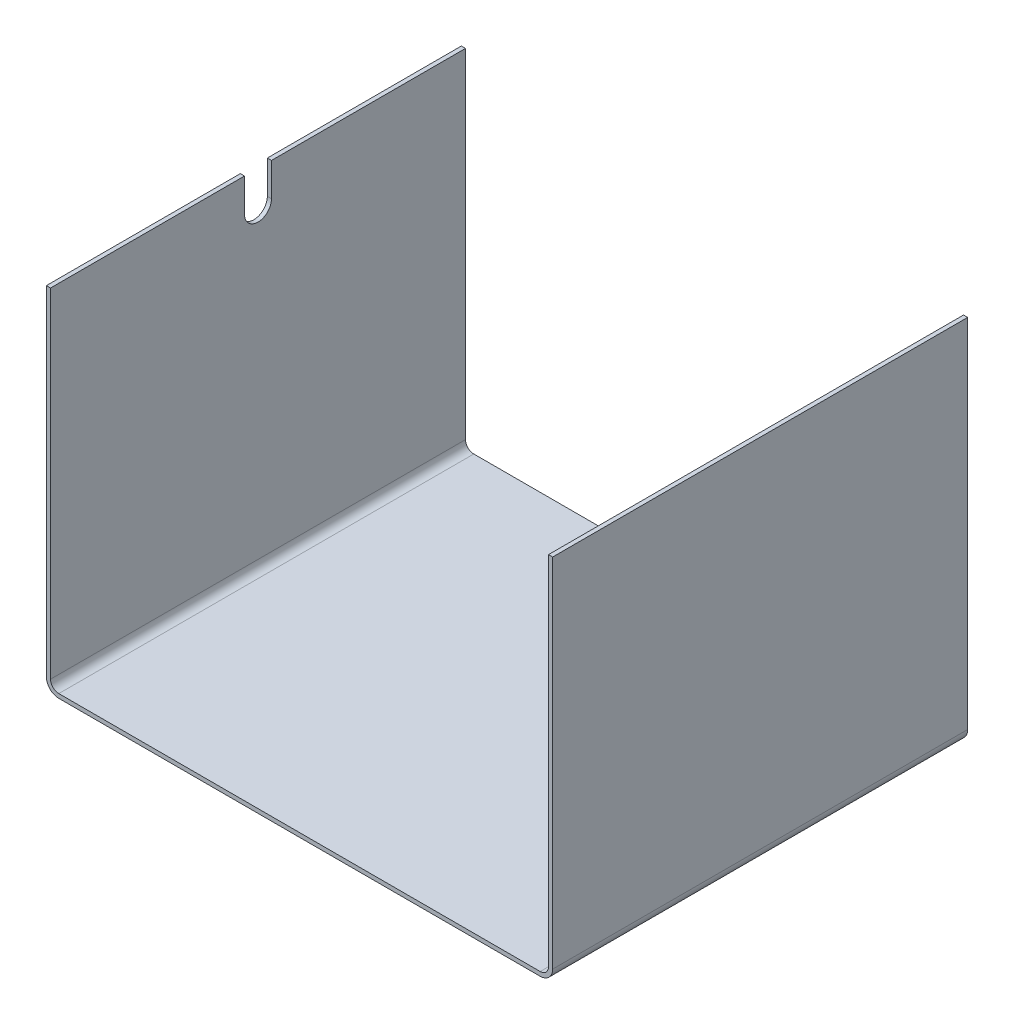
ISO-10303-21;
HEADER;
FILE_DESCRIPTION(('STEP AP214'),'2;1');
FILE_NAME('part.step','',(''),(''),'','','');
FILE_SCHEMA(('AUTOMOTIVE_DESIGN { 1 0 10303 214 1 1 1 1 }'));
ENDSEC;
DATA;
#1=APPLICATION_CONTEXT('core data for automotive mechanical design processes');
#2=APPLICATION_PROTOCOL_DEFINITION('international standard','automotive_design',2000,#1);
#3=PRODUCT_CONTEXT('',#1,'mechanical');
#4=PRODUCT('Part','Part','',(#3));
#5=PRODUCT_RELATED_PRODUCT_CATEGORY('part','',(#4));
#6=PRODUCT_DEFINITION_FORMATION('','',#4);
#7=PRODUCT_DEFINITION_CONTEXT('part definition',#1,'design');
#8=PRODUCT_DEFINITION('design','',#6,#7);
#9=PRODUCT_DEFINITION_SHAPE('','',#8);
#10=(LENGTH_UNIT() NAMED_UNIT(*) SI_UNIT(.MILLI.,.METRE.));
#11=(NAMED_UNIT(*) PLANE_ANGLE_UNIT() SI_UNIT($,.RADIAN.));
#12=(NAMED_UNIT(*) SI_UNIT($,.STERADIAN.) SOLID_ANGLE_UNIT());
#13=UNCERTAINTY_MEASURE_WITH_UNIT(LENGTH_MEASURE(1.E-05),#10,'distance_accuracy_value','');
#14=(GEOMETRIC_REPRESENTATION_CONTEXT(3) GLOBAL_UNCERTAINTY_ASSIGNED_CONTEXT((#13)) GLOBAL_UNIT_ASSIGNED_CONTEXT((#10,
#11,#12)) REPRESENTATION_CONTEXT('',''));
#15=CARTESIAN_POINT('',(0.,0.,0.));
#16=DIRECTION('',(0.,0.,1.));
#17=DIRECTION('',(1.,0.,0.));
#18=AXIS2_PLACEMENT_3D('',#15,#16,#17);
#19=CARTESIAN_POINT('',(60.,-28.,-60.0000000000001));
#20=DIRECTION('',(0.,1.,0.));
#21=DIRECTION('',(0.,0.,1.));
#22=AXIS2_PLACEMENT_3D('',#19,#20,#21);
#23=PLANE('',#22);
#24=DIRECTION('',(1.,0.,0.));
#25=VECTOR('',#24,1.);
#26=CARTESIAN_POINT('',(60.,-28.,-60.0000000000001));
#27=LINE('',#26,#25);
#28=CARTESIAN_POINT('',(60.,-28.,-60.0000000000001));
#29=VERTEX_POINT('',#28);
#30=CARTESIAN_POINT('',(61.,-28.,-60.0000000000001));
#31=VERTEX_POINT('',#30);
#32=EDGE_CURVE('E150',#29,#31,#27,.T.);
#33=ORIENTED_EDGE('',*,*,#32,.T.);
#34=DIRECTION('',(0.,0.,1.));
#35=VECTOR('',#34,1.);
#36=CARTESIAN_POINT('',(61.,-28.,-60.0000000000001));
#37=LINE('',#36,#35);
#38=CARTESIAN_POINT('',(61.,-28.,-160.));
#39=VERTEX_POINT('',#38);
#40=EDGE_CURVE('E153',#39,#31,#37,.T.);
#41=ORIENTED_EDGE('',*,*,#40,.F.);
#42=DIRECTION('',(1.,0.,0.));
#43=VECTOR('',#42,1.);
#44=CARTESIAN_POINT('',(60.,-28.,-160.));
#45=LINE('',#44,#43);
#46=CARTESIAN_POINT('',(60.,-28.,-160.));
#47=VERTEX_POINT('',#46);
#48=EDGE_CURVE('E138',#39,#47,#45,.F.);
#49=ORIENTED_EDGE('',*,*,#48,.T.);
#50=DIRECTION('',(0.,0.,1.));
#51=VECTOR('',#50,1.);
#52=CARTESIAN_POINT('',(60.,-28.,-60.0000000000001));
#53=LINE('',#52,#51);
#54=EDGE_CURVE('E225',#47,#29,#53,.T.);
#55=ORIENTED_EDGE('',*,*,#54,.T.);
#56=EDGE_LOOP('',(#33,#41,#49,#55));
#57=FACE_BOUND('',#56,.T.);
#58=ADVANCED_FACE('F18',(#57),#23,.T.);
#59=CARTESIAN_POINT('',(61.001,-40.3629314110954,-113.25));
#60=DIRECTION('',(0.,0.,-1.));
#61=DIRECTION('',(0.,1.,0.));
#62=AXIS2_PLACEMENT_3D('',#59,#60,#61);
#63=PLANE('',#62);
#64=DIRECTION('',(1.,0.,0.));
#65=VECTOR('',#64,1.);
#66=CARTESIAN_POINT('',(-61.,-32.3629314110954,-113.25));
#67=LINE('',#66,#65);
#68=CARTESIAN_POINT('',(-61.,-32.3629314110954,-113.25));
#69=VERTEX_POINT('',#68);
#70=CARTESIAN_POINT('',(-60.,-32.3629314110954,-113.25));
#71=VERTEX_POINT('',#70);
#72=EDGE_CURVE('E279',#69,#71,#67,.T.);
#73=ORIENTED_EDGE('',*,*,#72,.F.);
#74=DIRECTION('',(0.,-1.,0.));
#75=VECTOR('',#74,1.);
#76=CARTESIAN_POINT('',(-61.,-114.,-113.25));
#77=LINE('',#76,#75);
#78=CARTESIAN_POINT('',(-61.,-40.3629314110954,-113.25));
#79=VERTEX_POINT('',#78);
#80=EDGE_CURVE('E248',#79,#69,#77,.F.);
#81=ORIENTED_EDGE('',*,*,#80,.F.);
#82=DIRECTION('',(1.,0.,0.));
#83=VECTOR('',#82,1.);
#84=CARTESIAN_POINT('',(61.001,-40.3629314110954,-113.25));
#85=LINE('',#84,#83);
#86=CARTESIAN_POINT('',(-60.,-40.3629314110954,-113.25));
#87=VERTEX_POINT('',#86);
#88=EDGE_CURVE('E283',#87,#79,#85,.F.);
#89=ORIENTED_EDGE('',*,*,#88,.F.);
#90=DIRECTION('',(0.,-1.,0.));
#91=VECTOR('',#90,1.);
#92=CARTESIAN_POINT('',(-60.,-114.,-113.25));
#93=LINE('',#92,#91);
#94=EDGE_CURVE('E221',#87,#71,#93,.F.);
#95=ORIENTED_EDGE('',*,*,#94,.T.);
#96=EDGE_LOOP('',(#73,#81,#89,#95));
#97=FACE_BOUND('',#96,.T.);
#98=ADVANCED_FACE('F310',(#97),#63,.F.);
#99=CARTESIAN_POINT('',(-61.,-32.3629314110954,-60.0000000000001));
#100=DIRECTION('',(0.,1.,0.));
#101=DIRECTION('',(0.,0.,1.));
#102=AXIS2_PLACEMENT_3D('',#99,#100,#101);
#103=PLANE('',#102);
#104=DIRECTION('',(1.,0.,0.));
#105=VECTOR('',#104,1.);
#106=CARTESIAN_POINT('',(-61.,-32.3629314110954,-160.));
#107=LINE('',#106,#105);
#108=CARTESIAN_POINT('',(-60.,-32.3629314110954,-160.));
#109=VERTEX_POINT('',#108);
#110=CARTESIAN_POINT('',(-61.,-32.3629314110954,-160.));
#111=VERTEX_POINT('',#110);
#112=EDGE_CURVE('E275',#109,#111,#107,.F.);
#113=ORIENTED_EDGE('',*,*,#112,.T.);
#114=DIRECTION('',(0.,0.,1.));
#115=VECTOR('',#114,1.);
#116=CARTESIAN_POINT('',(-61.,-32.3629314110954,-60.0000000000001));
#117=LINE('',#116,#115);
#118=EDGE_CURVE('E250',#69,#111,#117,.F.);
#119=ORIENTED_EDGE('',*,*,#118,.F.);
#120=ORIENTED_EDGE('',*,*,#72,.T.);
#121=DIRECTION('',(0.,0.,1.));
#122=VECTOR('',#121,1.);
#123=CARTESIAN_POINT('',(-60.,-32.3629314110954,-60.0000000000001));
#124=LINE('',#123,#122);
#125=EDGE_CURVE('E224',#71,#109,#124,.F.);
#126=ORIENTED_EDGE('',*,*,#125,.T.);
#127=EDGE_LOOP('',(#113,#119,#120,#126));
#128=FACE_BOUND('',#127,.T.);
#129=ADVANCED_FACE('F315',(#128),#103,.T.);
#130=CARTESIAN_POINT('',(-61.,-32.3629314110954,-60.0000000000001));
#131=DIRECTION('',(0.,1.,0.));
#132=DIRECTION('',(0.,0.,1.));
#133=AXIS2_PLACEMENT_3D('',#130,#131,#132);
#134=PLANE('',#133);
#135=DIRECTION('',(1.,0.,0.));
#136=VECTOR('',#135,1.);
#137=CARTESIAN_POINT('',(-61.,-32.3629314110954,-60.0000000000001));
#138=LINE('',#137,#136);
#139=CARTESIAN_POINT('',(-61.,-32.3629314110954,-60.0000000000001));
#140=VERTEX_POINT('',#139);
#141=CARTESIAN_POINT('',(-60.,-32.3629314110954,-60.0000000000001));
#142=VERTEX_POINT('',#141);
#143=EDGE_CURVE('E271',#140,#142,#138,.T.);
#144=ORIENTED_EDGE('',*,*,#143,.T.);
#145=DIRECTION('',(0.,0.,1.));
#146=VECTOR('',#145,1.);
#147=CARTESIAN_POINT('',(-60.,-32.3629314110954,-60.0000000000001));
#148=LINE('',#147,#146);
#149=CARTESIAN_POINT('',(-60.,-32.3629314110954,-106.75));
#150=VERTEX_POINT('',#149);
#151=EDGE_CURVE('E218',#142,#150,#148,.F.);
#152=ORIENTED_EDGE('',*,*,#151,.T.);
#153=DIRECTION('',(1.,0.,0.));
#154=VECTOR('',#153,1.);
#155=CARTESIAN_POINT('',(61.001,-32.3629314110954,-106.75));
#156=LINE('',#155,#154);
#157=CARTESIAN_POINT('',(-61.,-32.3629314110954,-106.75));
#158=VERTEX_POINT('',#157);
#159=EDGE_CURVE('E116',#150,#158,#156,.F.);
#160=ORIENTED_EDGE('',*,*,#159,.T.);
#161=DIRECTION('',(0.,0.,1.));
#162=VECTOR('',#161,1.);
#163=CARTESIAN_POINT('',(-61.,-32.3629314110954,-60.0000000000001));
#164=LINE('',#163,#162);
#165=EDGE_CURVE('E247',#140,#158,#164,.F.);
#166=ORIENTED_EDGE('',*,*,#165,.F.);
#167=EDGE_LOOP('',(#144,#152,#160,#166));
#168=FACE_BOUND('',#167,.T.);
#169=ADVANCED_FACE('F332',(#168),#134,.T.);
#170=CARTESIAN_POINT('',(61.001,-32.3629314110954,-106.75));
#171=DIRECTION('',(0.,0.,1.));
#172=DIRECTION('',(0.,-1.,0.));
#173=AXIS2_PLACEMENT_3D('',#170,#171,#172);
#174=PLANE('',#173);
#175=DIRECTION('',(-1.,0.,0.));
#176=VECTOR('',#175,1.);
#177=CARTESIAN_POINT('',(61.001,-40.3629314110954,-106.75));
#178=LINE('',#177,#176);
#179=CARTESIAN_POINT('',(-60.,-40.3629314110954,-106.75));
#180=VERTEX_POINT('',#179);
#181=CARTESIAN_POINT('',(-61.,-40.3629314110954,-106.75));
#182=VERTEX_POINT('',#181);
#183=EDGE_CURVE('E255',#180,#182,#178,.T.);
#184=ORIENTED_EDGE('',*,*,#183,.T.);
#185=DIRECTION('',(0.,-1.,0.));
#186=VECTOR('',#185,1.);
#187=CARTESIAN_POINT('',(-61.,-114.,-106.75));
#188=LINE('',#187,#186);
#189=EDGE_CURVE('E253',#158,#182,#188,.T.);
#190=ORIENTED_EDGE('',*,*,#189,.F.);
#191=ORIENTED_EDGE('',*,*,#159,.F.);
#192=DIRECTION('',(0.,-1.,0.));
#193=VECTOR('',#192,1.);
#194=CARTESIAN_POINT('',(-60.,-114.,-106.75));
#195=LINE('',#194,#193);
#196=EDGE_CURVE('E214',#150,#180,#195,.T.);
#197=ORIENTED_EDGE('',*,*,#196,.T.);
#198=EDGE_LOOP('',(#184,#190,#191,#197));
#199=FACE_BOUND('',#198,.T.);
#200=ADVANCED_FACE('F334',(#199),#174,.F.);
#201=CARTESIAN_POINT('',(61.001,-40.3629314110954,-110.));
#202=DIRECTION('',(-1.,0.,0.));
#203=DIRECTION('',(0.,-1.,0.));
#204=AXIS2_PLACEMENT_3D('',#201,#202,#203);
#205=CYLINDRICAL_SURFACE('',#204,3.24999999999999);
#206=CARTESIAN_POINT('',(-60.,-40.3629314110954,-110.));
#207=DIRECTION('',(-1.,0.,0.));
#208=DIRECTION('',(0.,-1.,0.));
#209=AXIS2_PLACEMENT_3D('',#206,#207,#208);
#210=CIRCLE('',#209,3.24999999999999);
#211=EDGE_CURVE('E217',#180,#87,#210,.F.);
#212=ORIENTED_EDGE('',*,*,#211,.T.);
#213=ORIENTED_EDGE('',*,*,#88,.T.);
#214=CARTESIAN_POINT('',(-61.,-40.3629314110954,-110.));
#215=DIRECTION('',(-1.,0.,0.));
#216=DIRECTION('',(0.,-1.,0.));
#217=AXIS2_PLACEMENT_3D('',#214,#215,#216);
#218=CIRCLE('',#217,3.24999999999999);
#219=EDGE_CURVE('E21',#182,#79,#218,.F.);
#220=ORIENTED_EDGE('',*,*,#219,.F.);
#221=ORIENTED_EDGE('',*,*,#183,.F.);
#222=EDGE_LOOP('',(#212,#213,#220,#221));
#223=FACE_BOUND('',#222,.T.);
#224=ADVANCED_FACE('F303',(#223),#205,.F.);
#225=CARTESIAN_POINT('',(-61.,-114.,-60.0000000000001));
#226=DIRECTION('',(-1.,0.,0.));
#227=DIRECTION('',(0.,-1.,0.));
#228=AXIS2_PLACEMENT_3D('',#225,#226,#227);
#229=PLANE('',#228);
#230=DIRECTION('',(0.,1.,0.));
#231=VECTOR('',#230,1.);
#232=CARTESIAN_POINT('',(-61.,-114.,-60.0000000000001));
#233=LINE('',#232,#231);
#234=CARTESIAN_POINT('',(-61.,-114.,-60.0000000000001));
#235=VERTEX_POINT('',#234);
#236=EDGE_CURVE('E204',#140,#235,#233,.F.);
#237=ORIENTED_EDGE('',*,*,#236,.F.);
#238=ORIENTED_EDGE('',*,*,#165,.T.);
#239=ORIENTED_EDGE('',*,*,#189,.T.);
#240=ORIENTED_EDGE('',*,*,#219,.T.);
#241=ORIENTED_EDGE('',*,*,#80,.T.);
#242=ORIENTED_EDGE('',*,*,#118,.T.);
#243=DIRECTION('',(0.,1.,0.));
#244=VECTOR('',#243,1.);
#245=CARTESIAN_POINT('',(-61.,-114.,-160.));
#246=LINE('',#245,#244);
#247=CARTESIAN_POINT('',(-61.,-114.,-160.));
#248=VERTEX_POINT('',#247);
#249=EDGE_CURVE('E176',#111,#248,#246,.F.);
#250=ORIENTED_EDGE('',*,*,#249,.T.);
#251=DIRECTION('',(0.,0.,-1.));
#252=VECTOR('',#251,1.);
#253=CARTESIAN_POINT('',(-61.,-114.,-60.0000000000001));
#254=LINE('',#253,#252);
#255=EDGE_CURVE('E245',#235,#248,#254,.T.);
#256=ORIENTED_EDGE('',*,*,#255,.F.);
#257=EDGE_LOOP('',(#237,#238,#239,#240,#241,#242,#250,#256));
#258=FACE_BOUND('',#257,.T.);
#259=ADVANCED_FACE('F319',(#258),#229,.T.);
#260=CARTESIAN_POINT('',(-58.,-114.,-60.0000000000001));
#261=DIRECTION('',(0.,0.,-1.));
#262=DIRECTION('',(-1.,0.,0.));
#263=AXIS2_PLACEMENT_3D('',#260,#261,#262);
#264=CYLINDRICAL_SURFACE('',#263,3.00000000000002);
#265=CARTESIAN_POINT('',(-58.,-114.,-60.0000000000001));
#266=DIRECTION('',(0.,0.,-1.));
#267=DIRECTION('',(-1.,0.,0.));
#268=AXIS2_PLACEMENT_3D('',#265,#266,#267);
#269=CIRCLE('',#268,3.00000000000002);
#270=CARTESIAN_POINT('',(-58.,-117.,-60.0000000000001));
#271=VERTEX_POINT('',#270);
#272=EDGE_CURVE('E203',#235,#271,#269,.F.);
#273=ORIENTED_EDGE('',*,*,#272,.F.);
#274=ORIENTED_EDGE('',*,*,#255,.T.);
#275=CARTESIAN_POINT('',(-58.,-114.,-160.));
#276=DIRECTION('',(0.,0.,-1.));
#277=DIRECTION('',(-1.,0.,0.));
#278=AXIS2_PLACEMENT_3D('',#275,#276,#277);
#279=CIRCLE('',#278,3.00000000000002);
#280=CARTESIAN_POINT('',(-58.,-117.,-160.));
#281=VERTEX_POINT('',#280);
#282=EDGE_CURVE('E175',#248,#281,#279,.F.);
#283=ORIENTED_EDGE('',*,*,#282,.T.);
#284=DIRECTION('',(0.,0.,1.));
#285=VECTOR('',#284,1.);
#286=CARTESIAN_POINT('',(-58.,-117.,-60.0000000000001));
#287=LINE('',#286,#285);
#288=EDGE_CURVE('E243',#271,#281,#287,.F.);
#289=ORIENTED_EDGE('',*,*,#288,.F.);
#290=EDGE_LOOP('',(#273,#274,#283,#289));
#291=FACE_BOUND('',#290,.T.);
#292=ADVANCED_FACE('F326',(#291),#264,.T.);
#293=CARTESIAN_POINT('',(58.,-117.,-60.0000000000001));
#294=DIRECTION('',(0.,-1.,0.));
#295=DIRECTION('',(1.,0.,0.));
#296=AXIS2_PLACEMENT_3D('',#293,#294,#295);
#297=PLANE('',#296);
#298=DIRECTION('',(1.,0.,0.));
#299=VECTOR('',#298,1.);
#300=CARTESIAN_POINT('',(-58.,-117.,-60.0000000000001));
#301=LINE('',#300,#299);
#302=CARTESIAN_POINT('',(58.,-117.,-60.0000000000001));
#303=VERTEX_POINT('',#302);
#304=EDGE_CURVE('E201',#271,#303,#301,.T.);
#305=ORIENTED_EDGE('',*,*,#304,.F.);
#306=ORIENTED_EDGE('',*,*,#288,.T.);
#307=DIRECTION('',(1.,0.,0.));
#308=VECTOR('',#307,1.);
#309=CARTESIAN_POINT('',(-58.,-117.,-160.));
#310=LINE('',#309,#308);
#311=CARTESIAN_POINT('',(58.,-117.,-160.));
#312=VERTEX_POINT('',#311);
#313=EDGE_CURVE('E166',#281,#312,#310,.T.);
#314=ORIENTED_EDGE('',*,*,#313,.T.);
#315=DIRECTION('',(0.,0.,-1.));
#316=VECTOR('',#315,1.);
#317=CARTESIAN_POINT('',(58.,-117.,-60.0000000000001));
#318=LINE('',#317,#316);
#319=EDGE_CURVE('E158',#303,#312,#318,.T.);
#320=ORIENTED_EDGE('',*,*,#319,.F.);
#321=EDGE_LOOP('',(#305,#306,#314,#320));
#322=FACE_BOUND('',#321,.T.);
#323=ADVANCED_FACE('F375',(#322),#297,.T.);
#324=CARTESIAN_POINT('',(58.,-114.,-60.0000000000001));
#325=DIRECTION('',(0.,0.,-1.));
#326=DIRECTION('',(-1.,0.,0.));
#327=AXIS2_PLACEMENT_3D('',#324,#325,#326);
#328=CYLINDRICAL_SURFACE('',#327,3.);
#329=CARTESIAN_POINT('',(58.,-114.,-60.0000000000001));
#330=DIRECTION('',(0.,0.,-1.));
#331=DIRECTION('',(-1.,0.,0.));
#332=AXIS2_PLACEMENT_3D('',#329,#330,#331);
#333=CIRCLE('',#332,3.);
#334=CARTESIAN_POINT('',(61.,-114.,-60.0000000000001));
#335=VERTEX_POINT('',#334);
#336=EDGE_CURVE('E198',#303,#335,#333,.F.);
#337=ORIENTED_EDGE('',*,*,#336,.F.);
#338=ORIENTED_EDGE('',*,*,#319,.T.);
#339=CARTESIAN_POINT('',(58.,-114.,-160.));
#340=DIRECTION('',(0.,0.,-1.));
#341=DIRECTION('',(-1.,0.,0.));
#342=AXIS2_PLACEMENT_3D('',#339,#340,#341);
#343=CIRCLE('',#342,3.);
#344=CARTESIAN_POINT('',(61.,-114.,-160.));
#345=VERTEX_POINT('',#344);
#346=EDGE_CURVE('E162',#312,#345,#343,.F.);
#347=ORIENTED_EDGE('',*,*,#346,.T.);
#348=DIRECTION('',(0.,0.,1.));
#349=VECTOR('',#348,1.);
#350=CARTESIAN_POINT('',(61.,-114.,-60.0000000000001));
#351=LINE('',#350,#349);
#352=EDGE_CURVE('E157',#335,#345,#351,.F.);
#353=ORIENTED_EDGE('',*,*,#352,.F.);
#354=EDGE_LOOP('',(#337,#338,#347,#353));
#355=FACE_BOUND('',#354,.T.);
#356=ADVANCED_FACE('F372',(#355),#328,.T.);
#357=CARTESIAN_POINT('',(61.,-28.,-60.0000000000001));
#358=DIRECTION('',(1.,0.,0.));
#359=DIRECTION('',(0.,1.,0.));
#360=AXIS2_PLACEMENT_3D('',#357,#358,#359);
#361=PLANE('',#360);
#362=DIRECTION('',(0.,1.,0.));
#363=VECTOR('',#362,1.);
#364=CARTESIAN_POINT('',(61.,-114.,-60.0000000000001));
#365=LINE('',#364,#363);
#366=EDGE_CURVE('E194',#335,#31,#365,.T.);
#367=ORIENTED_EDGE('',*,*,#366,.F.);
#368=ORIENTED_EDGE('',*,*,#352,.T.);
#369=DIRECTION('',(0.,1.,0.));
#370=VECTOR('',#369,1.);
#371=CARTESIAN_POINT('',(61.,-114.,-160.));
#372=LINE('',#371,#370);
#373=EDGE_CURVE('E145',#345,#39,#372,.T.);
#374=ORIENTED_EDGE('',*,*,#373,.T.);
#375=ORIENTED_EDGE('',*,*,#40,.T.);
#376=EDGE_LOOP('',(#367,#368,#374,#375));
#377=FACE_BOUND('',#376,.T.);
#378=ADVANCED_FACE('F160',(#377),#361,.T.);
#379=CARTESIAN_POINT('',(60.,-28.,-60.0000000000001));
#380=DIRECTION('',(1.,0.,0.));
#381=DIRECTION('',(0.,1.,0.));
#382=AXIS2_PLACEMENT_3D('',#379,#380,#381);
#383=PLANE('',#382);
#384=DIRECTION('',(0.,0.,-1.));
#385=VECTOR('',#384,1.);
#386=CARTESIAN_POINT('',(60.,-114.,-60.0000000000001));
#387=LINE('',#386,#385);
#388=CARTESIAN_POINT('',(60.,-114.,-160.));
#389=VERTEX_POINT('',#388);
#390=CARTESIAN_POINT('',(60.,-114.,-60.0000000000001));
#391=VERTEX_POINT('',#390);
#392=EDGE_CURVE('E211',#389,#391,#387,.F.);
#393=ORIENTED_EDGE('',*,*,#392,.T.);
#394=DIRECTION('',(0.,1.,0.));
#395=VECTOR('',#394,1.);
#396=CARTESIAN_POINT('',(60.,-114.,-60.0000000000001));
#397=LINE('',#396,#395);
#398=EDGE_CURVE('E191',#29,#391,#397,.F.);
#399=ORIENTED_EDGE('',*,*,#398,.F.);
#400=ORIENTED_EDGE('',*,*,#54,.F.);
#401=DIRECTION('',(0.,1.,0.));
#402=VECTOR('',#401,1.);
#403=CARTESIAN_POINT('',(60.,-114.,-160.));
#404=LINE('',#403,#402);
#405=EDGE_CURVE('E149',#47,#389,#404,.F.);
#406=ORIENTED_EDGE('',*,*,#405,.T.);
#407=EDGE_LOOP('',(#393,#399,#400,#406));
#408=FACE_BOUND('',#407,.T.);
#409=ADVANCED_FACE('F366',(#408),#383,.F.);
#410=CARTESIAN_POINT('',(-60.,-114.,-60.0000000000001));
#411=DIRECTION('',(-1.,0.,0.));
#412=DIRECTION('',(0.,-1.,0.));
#413=AXIS2_PLACEMENT_3D('',#410,#411,#412);
#414=PLANE('',#413);
#415=ORIENTED_EDGE('',*,*,#196,.F.);
#416=ORIENTED_EDGE('',*,*,#151,.F.);
#417=DIRECTION('',(0.,1.,0.));
#418=VECTOR('',#417,1.);
#419=CARTESIAN_POINT('',(-60.,-114.,-60.0000000000001));
#420=LINE('',#419,#418);
#421=CARTESIAN_POINT('',(-60.,-114.,-60.0000000000001));
#422=VERTEX_POINT('',#421);
#423=EDGE_CURVE('E206',#422,#142,#420,.T.);
#424=ORIENTED_EDGE('',*,*,#423,.F.);
#425=DIRECTION('',(0.,0.,-1.));
#426=VECTOR('',#425,1.);
#427=CARTESIAN_POINT('',(-60.,-114.,-60.0000000000001));
#428=LINE('',#427,#426);
#429=CARTESIAN_POINT('',(-60.,-114.,-160.));
#430=VERTEX_POINT('',#429);
#431=EDGE_CURVE('E179',#422,#430,#428,.T.);
#432=ORIENTED_EDGE('',*,*,#431,.T.);
#433=DIRECTION('',(0.,1.,0.));
#434=VECTOR('',#433,1.);
#435=CARTESIAN_POINT('',(-60.,-114.,-160.));
#436=LINE('',#435,#434);
#437=EDGE_CURVE('E188',#430,#109,#436,.T.);
#438=ORIENTED_EDGE('',*,*,#437,.T.);
#439=ORIENTED_EDGE('',*,*,#125,.F.);
#440=ORIENTED_EDGE('',*,*,#94,.F.);
#441=ORIENTED_EDGE('',*,*,#211,.F.);
#442=EDGE_LOOP('',(#415,#416,#424,#432,#438,#439,#440,#441));
#443=FACE_BOUND('',#442,.T.);
#444=ADVANCED_FACE('F312',(#443),#414,.F.);
#445=CARTESIAN_POINT('',(58.,-114.,-60.0000000000001));
#446=DIRECTION('',(0.,0.,-1.));
#447=DIRECTION('',(-1.,0.,0.));
#448=AXIS2_PLACEMENT_3D('',#445,#446,#447);
#449=CYLINDRICAL_SURFACE('',#448,2.);
#450=DIRECTION('',(0.,0.,1.));
#451=VECTOR('',#450,1.);
#452=CARTESIAN_POINT('',(58.,-116.,-60.0000000000001));
#453=LINE('',#452,#451);
#454=CARTESIAN_POINT('',(58.,-116.,-160.));
#455=VERTEX_POINT('',#454);
#456=CARTESIAN_POINT('',(58.,-116.,-60.0000000000001));
#457=VERTEX_POINT('',#456);
#458=EDGE_CURVE('E185',#455,#457,#453,.T.);
#459=ORIENTED_EDGE('',*,*,#458,.T.);
#460=CARTESIAN_POINT('',(58.,-114.,-60.0000000000001));
#461=DIRECTION('',(0.,0.,-1.));
#462=DIRECTION('',(-1.,0.,0.));
#463=AXIS2_PLACEMENT_3D('',#460,#461,#462);
#464=CIRCLE('',#463,2.);
#465=EDGE_CURVE('E193',#391,#457,#464,.T.);
#466=ORIENTED_EDGE('',*,*,#465,.F.);
#467=ORIENTED_EDGE('',*,*,#392,.F.);
#468=CARTESIAN_POINT('',(58.,-114.,-160.));
#469=DIRECTION('',(0.,0.,-1.));
#470=DIRECTION('',(-1.,0.,0.));
#471=AXIS2_PLACEMENT_3D('',#468,#469,#470);
#472=CIRCLE('',#471,2.);
#473=EDGE_CURVE('E164',#389,#455,#472,.T.);
#474=ORIENTED_EDGE('',*,*,#473,.T.);
#475=EDGE_LOOP('',(#459,#466,#467,#474));
#476=FACE_BOUND('',#475,.T.);
#477=ADVANCED_FACE('F360',(#476),#449,.F.);
#478=CARTESIAN_POINT('',(-58.,-114.,-60.0000000000001));
#479=DIRECTION('',(0.,0.,1.));
#480=DIRECTION('',(1.,0.,0.));
#481=AXIS2_PLACEMENT_3D('',#478,#479,#480);
#482=PLANE('',#481);
#483=DIRECTION('',(1.,0.,0.));
#484=VECTOR('',#483,1.);
#485=CARTESIAN_POINT('',(58.,-116.,-60.0000000000001));
#486=LINE('',#485,#484);
#487=CARTESIAN_POINT('',(-58.,-116.,-60.0000000000001));
#488=VERTEX_POINT('',#487);
#489=EDGE_CURVE('E183',#457,#488,#486,.F.);
#490=ORIENTED_EDGE('',*,*,#489,.T.);
#491=CARTESIAN_POINT('',(-58.,-114.,-60.0000000000001));
#492=DIRECTION('',(0.,0.,-1.));
#493=DIRECTION('',(-1.,0.,0.));
#494=AXIS2_PLACEMENT_3D('',#491,#492,#493);
#495=CIRCLE('',#494,2.00000000000002);
#496=EDGE_CURVE('E233',#488,#422,#495,.T.);
#497=ORIENTED_EDGE('',*,*,#496,.T.);
#498=ORIENTED_EDGE('',*,*,#423,.T.);
#499=ORIENTED_EDGE('',*,*,#143,.F.);
#500=ORIENTED_EDGE('',*,*,#236,.T.);
#501=ORIENTED_EDGE('',*,*,#272,.T.);
#502=ORIENTED_EDGE('',*,*,#304,.T.);
#503=ORIENTED_EDGE('',*,*,#336,.T.);
#504=ORIENTED_EDGE('',*,*,#366,.T.);
#505=ORIENTED_EDGE('',*,*,#32,.F.);
#506=ORIENTED_EDGE('',*,*,#398,.T.);
#507=ORIENTED_EDGE('',*,*,#465,.T.);
#508=EDGE_LOOP('',(#490,#497,#498,#499,#500,#501,#502,#503,#504,#505,#506,#507));
#509=FACE_BOUND('',#508,.T.);
#510=ADVANCED_FACE('F330',(#509),#482,.T.);
#511=CARTESIAN_POINT('',(-58.,-114.,-60.0000000000001));
#512=DIRECTION('',(0.,0.,-1.));
#513=DIRECTION('',(-1.,0.,0.));
#514=AXIS2_PLACEMENT_3D('',#511,#512,#513);
#515=CYLINDRICAL_SURFACE('',#514,2.00000000000002);
#516=ORIENTED_EDGE('',*,*,#431,.F.);
#517=ORIENTED_EDGE('',*,*,#496,.F.);
#518=DIRECTION('',(0.,0.,1.));
#519=VECTOR('',#518,1.);
#520=CARTESIAN_POINT('',(-58.,-116.,-60.0000000000001));
#521=LINE('',#520,#519);
#522=CARTESIAN_POINT('',(-58.,-116.,-160.));
#523=VERTEX_POINT('',#522);
#524=EDGE_CURVE('E27',#488,#523,#521,.F.);
#525=ORIENTED_EDGE('',*,*,#524,.T.);
#526=CARTESIAN_POINT('',(-58.,-114.,-160.));
#527=DIRECTION('',(0.,0.,-1.));
#528=DIRECTION('',(-1.,0.,0.));
#529=AXIS2_PLACEMENT_3D('',#526,#527,#528);
#530=CIRCLE('',#529,2.00000000000002);
#531=EDGE_CURVE('E35',#523,#430,#530,.T.);
#532=ORIENTED_EDGE('',*,*,#531,.T.);
#533=EDGE_LOOP('',(#516,#517,#525,#532));
#534=FACE_BOUND('',#533,.T.);
#535=ADVANCED_FACE('F351',(#534),#515,.F.);
#536=CARTESIAN_POINT('',(-58.,-114.,-160.));
#537=DIRECTION('',(0.,0.,1.));
#538=DIRECTION('',(1.,0.,0.));
#539=AXIS2_PLACEMENT_3D('',#536,#537,#538);
#540=PLANE('',#539);
#541=ORIENTED_EDGE('',*,*,#531,.F.);
#542=DIRECTION('',(1.,0.,0.));
#543=VECTOR('',#542,1.);
#544=CARTESIAN_POINT('',(58.,-116.,-160.));
#545=LINE('',#544,#543);
#546=EDGE_CURVE('E11',#523,#455,#545,.T.);
#547=ORIENTED_EDGE('',*,*,#546,.T.);
#548=ORIENTED_EDGE('',*,*,#473,.F.);
#549=ORIENTED_EDGE('',*,*,#405,.F.);
#550=ORIENTED_EDGE('',*,*,#48,.F.);
#551=ORIENTED_EDGE('',*,*,#373,.F.);
#552=ORIENTED_EDGE('',*,*,#346,.F.);
#553=ORIENTED_EDGE('',*,*,#313,.F.);
#554=ORIENTED_EDGE('',*,*,#282,.F.);
#555=ORIENTED_EDGE('',*,*,#249,.F.);
#556=ORIENTED_EDGE('',*,*,#112,.F.);
#557=ORIENTED_EDGE('',*,*,#437,.F.);
#558=EDGE_LOOP('',(#541,#547,#548,#549,#550,#551,#552,#553,#554,#555,#556,#557));
#559=FACE_BOUND('',#558,.T.);
#560=ADVANCED_FACE('F142',(#559),#540,.F.);
#561=CARTESIAN_POINT('',(58.,-116.,-60.0000000000001));
#562=DIRECTION('',(0.,-1.,0.));
#563=DIRECTION('',(1.,0.,0.));
#564=AXIS2_PLACEMENT_3D('',#561,#562,#563);
#565=PLANE('',#564);
#566=ORIENTED_EDGE('',*,*,#524,.F.);
#567=ORIENTED_EDGE('',*,*,#489,.F.);
#568=ORIENTED_EDGE('',*,*,#458,.F.);
#569=ORIENTED_EDGE('',*,*,#546,.F.);
#570=EDGE_LOOP('',(#566,#567,#568,#569));
#571=FACE_BOUND('',#570,.T.);
#572=ADVANCED_FACE('F344',(#571),#565,.F.);
#573=CLOSED_SHELL('',(#58,#98,#129,#169,#200,#224,#259,#292,#323,#356,#378,#409,#444,#477,#510,
#535,#560,#572));
#574=MANIFOLD_SOLID_BREP('B1',#573);
#575=ADVANCED_BREP_SHAPE_REPRESENTATION('',(#18,#574),#14);
#576=SHAPE_DEFINITION_REPRESENTATION(#9,#575);
ENDSEC;
END-ISO-10303-21;
